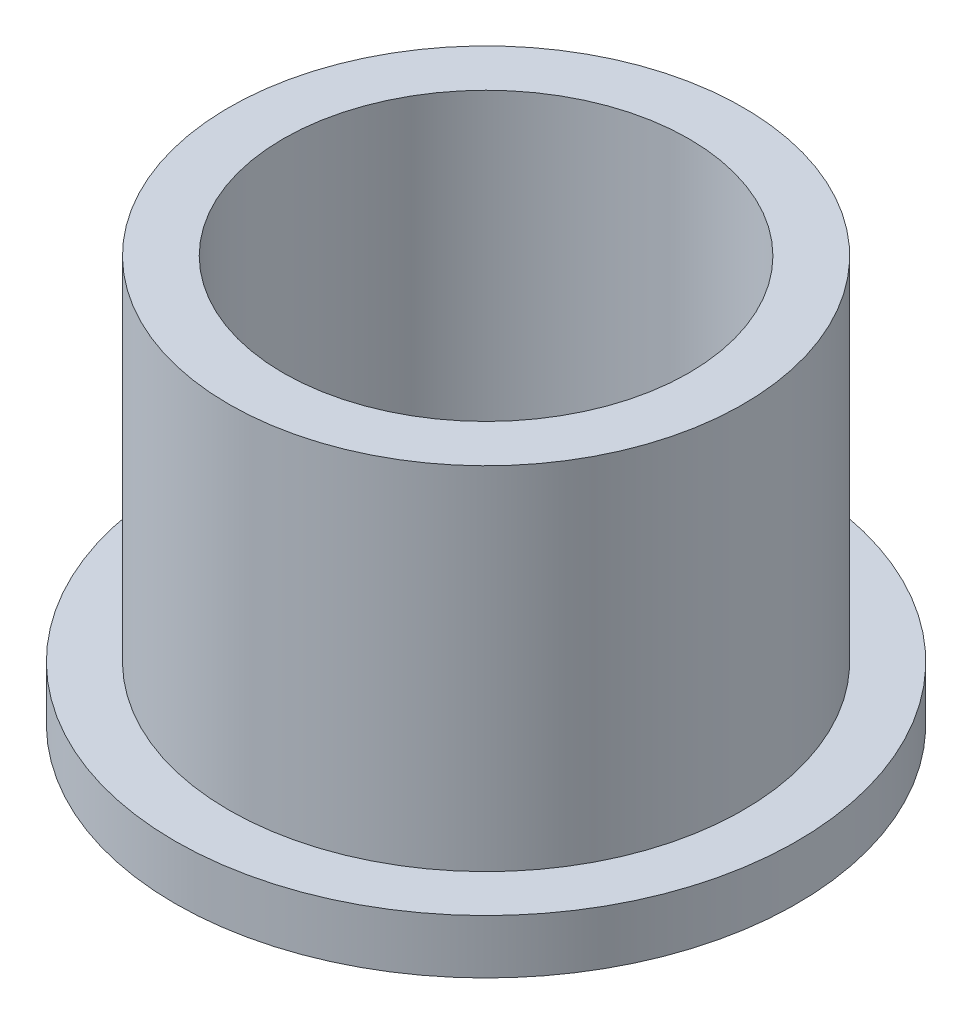
ISO-10303-21;
HEADER;
FILE_DESCRIPTION(('STEP AP214'),'2;1');
FILE_NAME('part.step','',(''),(''),'','','');
FILE_SCHEMA(('AUTOMOTIVE_DESIGN { 1 0 10303 214 1 1 1 1 }'));
ENDSEC;
DATA;
#1=APPLICATION_CONTEXT('core data for automotive mechanical design processes');
#2=APPLICATION_PROTOCOL_DEFINITION('international standard','automotive_design',2000,#1);
#3=PRODUCT_CONTEXT('',#1,'mechanical');
#4=PRODUCT('Part','Part','',(#3));
#5=PRODUCT_RELATED_PRODUCT_CATEGORY('part','',(#4));
#6=PRODUCT_DEFINITION_FORMATION('','',#4);
#7=PRODUCT_DEFINITION_CONTEXT('part definition',#1,'design');
#8=PRODUCT_DEFINITION('design','',#6,#7);
#9=PRODUCT_DEFINITION_SHAPE('','',#8);
#10=(LENGTH_UNIT() NAMED_UNIT(*) SI_UNIT(.MILLI.,.METRE.));
#11=(NAMED_UNIT(*) PLANE_ANGLE_UNIT() SI_UNIT($,.RADIAN.));
#12=(NAMED_UNIT(*) SI_UNIT($,.STERADIAN.) SOLID_ANGLE_UNIT());
#13=UNCERTAINTY_MEASURE_WITH_UNIT(LENGTH_MEASURE(1.E-05),#10,'distance_accuracy_value','');
#14=(GEOMETRIC_REPRESENTATION_CONTEXT(3) GLOBAL_UNCERTAINTY_ASSIGNED_CONTEXT((#13)) GLOBAL_UNIT_ASSIGNED_CONTEXT((#10,
#11,#12)) REPRESENTATION_CONTEXT('',''));
#15=CARTESIAN_POINT('',(0.,0.,0.));
#16=DIRECTION('',(0.,0.,1.));
#17=DIRECTION('',(1.,0.,0.));
#18=AXIS2_PLACEMENT_3D('',#15,#16,#17);
#19=CARTESIAN_POINT('',(0.,30.,0.));
#20=DIRECTION('',(0.,1.,0.));
#21=DIRECTION('',(0.,0.,1.));
#22=AXIS2_PLACEMENT_3D('',#19,#20,#21);
#23=PLANE('',#22);
#24=CARTESIAN_POINT('',(0.,30.,0.));
#25=DIRECTION('',(0.,1.,0.));
#26=DIRECTION('',(0.,0.,1.));
#27=AXIS2_PLACEMENT_3D('',#24,#25,#26);
#28=CIRCLE('',#27,19.02);
#29=CARTESIAN_POINT('',(0.,30.,19.02));
#30=VERTEX_POINT('',#29);
#31=EDGE_CURVE('E10',#30,#30,#28,.T.);
#32=ORIENTED_EDGE('',*,*,#31,.T.);
#33=EDGE_LOOP('',(#32));
#34=FACE_BOUND('',#33,.T.);
#35=CARTESIAN_POINT('',(0.,30.,0.));
#36=DIRECTION('',(0.,1.,0.));
#37=DIRECTION('',(0.,0.,1.));
#38=AXIS2_PLACEMENT_3D('',#35,#36,#37);
#39=CIRCLE('',#38,15.005);
#40=CARTESIAN_POINT('',(0.,30.,15.005));
#41=VERTEX_POINT('',#40);
#42=EDGE_CURVE('E38',#41,#41,#39,.T.);
#43=ORIENTED_EDGE('',*,*,#42,.F.);
#44=EDGE_LOOP('',(#43));
#45=FACE_BOUND('',#44,.T.);
#46=ADVANCED_FACE('F31',(#34,#45),#23,.T.);
#47=CARTESIAN_POINT('',(0.,0.,0.));
#48=DIRECTION('',(0.,1.,0.));
#49=DIRECTION('',(0.,0.,1.));
#50=AXIS2_PLACEMENT_3D('',#47,#48,#49);
#51=PLANE('',#50);
#52=CARTESIAN_POINT('',(0.,0.,0.));
#53=DIRECTION('',(0.,1.,0.));
#54=DIRECTION('',(0.,0.,1.));
#55=AXIS2_PLACEMENT_3D('',#52,#53,#54);
#56=CIRCLE('',#55,15.005);
#57=CARTESIAN_POINT('',(0.,0.,15.005));
#58=VERTEX_POINT('',#57);
#59=EDGE_CURVE('E42',#58,#58,#56,.T.);
#60=ORIENTED_EDGE('',*,*,#59,.T.);
#61=EDGE_LOOP('',(#60));
#62=FACE_BOUND('',#61,.T.);
#63=CARTESIAN_POINT('',(0.,0.,0.));
#64=DIRECTION('',(0.,1.,0.));
#65=DIRECTION('',(0.,0.,1.));
#66=AXIS2_PLACEMENT_3D('',#63,#64,#65);
#67=CIRCLE('',#66,23.);
#68=CARTESIAN_POINT('',(0.,0.,23.));
#69=VERTEX_POINT('',#68);
#70=EDGE_CURVE('E49',#69,#69,#67,.T.);
#71=ORIENTED_EDGE('',*,*,#70,.F.);
#72=EDGE_LOOP('',(#71));
#73=FACE_BOUND('',#72,.T.);
#74=ADVANCED_FACE('F74',(#62,#73),#51,.F.);
#75=CARTESIAN_POINT('',(0.,30.,0.));
#76=DIRECTION('',(0.,-1.,0.));
#77=DIRECTION('',(0.,0.,-1.));
#78=AXIS2_PLACEMENT_3D('',#75,#76,#77);
#79=CYLINDRICAL_SURFACE('',#78,19.02);
#80=CARTESIAN_POINT('',(0.,4.,0.));
#81=DIRECTION('',(0.,1.,0.));
#82=DIRECTION('',(0.,0.,1.));
#83=AXIS2_PLACEMENT_3D('',#80,#81,#82);
#84=CIRCLE('',#83,19.02);
#85=CARTESIAN_POINT('',(0.,4.,19.02));
#86=VERTEX_POINT('',#85);
#87=EDGE_CURVE('E52',#86,#86,#84,.T.);
#88=ORIENTED_EDGE('',*,*,#87,.T.);
#89=EDGE_LOOP('',(#88));
#90=FACE_BOUND('',#89,.T.);
#91=ORIENTED_EDGE('',*,*,#31,.F.);
#92=EDGE_LOOP('',(#91));
#93=FACE_BOUND('',#92,.T.);
#94=ADVANCED_FACE('F33',(#90,#93),#79,.T.);
#95=CARTESIAN_POINT('',(0.,30.,0.));
#96=DIRECTION('',(0.,-1.,0.));
#97=DIRECTION('',(0.,0.,-1.));
#98=AXIS2_PLACEMENT_3D('',#95,#96,#97);
#99=CYLINDRICAL_SURFACE('',#98,15.005);
#100=ORIENTED_EDGE('',*,*,#42,.T.);
#101=EDGE_LOOP('',(#100));
#102=FACE_BOUND('',#101,.T.);
#103=ORIENTED_EDGE('',*,*,#59,.F.);
#104=EDGE_LOOP('',(#103));
#105=FACE_BOUND('',#104,.T.);
#106=ADVANCED_FACE('F63',(#102,#105),#99,.F.);
#107=CARTESIAN_POINT('',(0.,4.,0.));
#108=DIRECTION('',(0.,1.,0.));
#109=DIRECTION('',(0.,0.,1.));
#110=AXIS2_PLACEMENT_3D('',#107,#108,#109);
#111=PLANE('',#110);
#112=CARTESIAN_POINT('',(0.,4.,0.));
#113=DIRECTION('',(0.,1.,0.));
#114=DIRECTION('',(0.,0.,1.));
#115=AXIS2_PLACEMENT_3D('',#112,#113,#114);
#116=CIRCLE('',#115,23.);
#117=CARTESIAN_POINT('',(0.,4.,23.));
#118=VERTEX_POINT('',#117);
#119=EDGE_CURVE('E47',#118,#118,#116,.T.);
#120=ORIENTED_EDGE('',*,*,#119,.T.);
#121=EDGE_LOOP('',(#120));
#122=FACE_BOUND('',#121,.T.);
#123=ORIENTED_EDGE('',*,*,#87,.F.);
#124=EDGE_LOOP('',(#123));
#125=FACE_BOUND('',#124,.T.);
#126=ADVANCED_FACE('F60',(#122,#125),#111,.T.);
#127=CARTESIAN_POINT('',(0.,4.,0.));
#128=DIRECTION('',(0.,-1.,0.));
#129=DIRECTION('',(0.,0.,-1.));
#130=AXIS2_PLACEMENT_3D('',#127,#128,#129);
#131=CYLINDRICAL_SURFACE('',#130,23.);
#132=ORIENTED_EDGE('',*,*,#119,.F.);
#133=EDGE_LOOP('',(#132));
#134=FACE_BOUND('',#133,.T.);
#135=ORIENTED_EDGE('',*,*,#70,.T.);
#136=EDGE_LOOP('',(#135));
#137=FACE_BOUND('',#136,.T.);
#138=ADVANCED_FACE('F62',(#134,#137),#131,.T.);
#139=CLOSED_SHELL('',(#46,#74,#94,#106,#126,#138));
#140=MANIFOLD_SOLID_BREP('B2',#139);
#141=ADVANCED_BREP_SHAPE_REPRESENTATION('',(#18,#140),#14);
#142=SHAPE_DEFINITION_REPRESENTATION(#9,#141);
ENDSEC;
END-ISO-10303-21;
